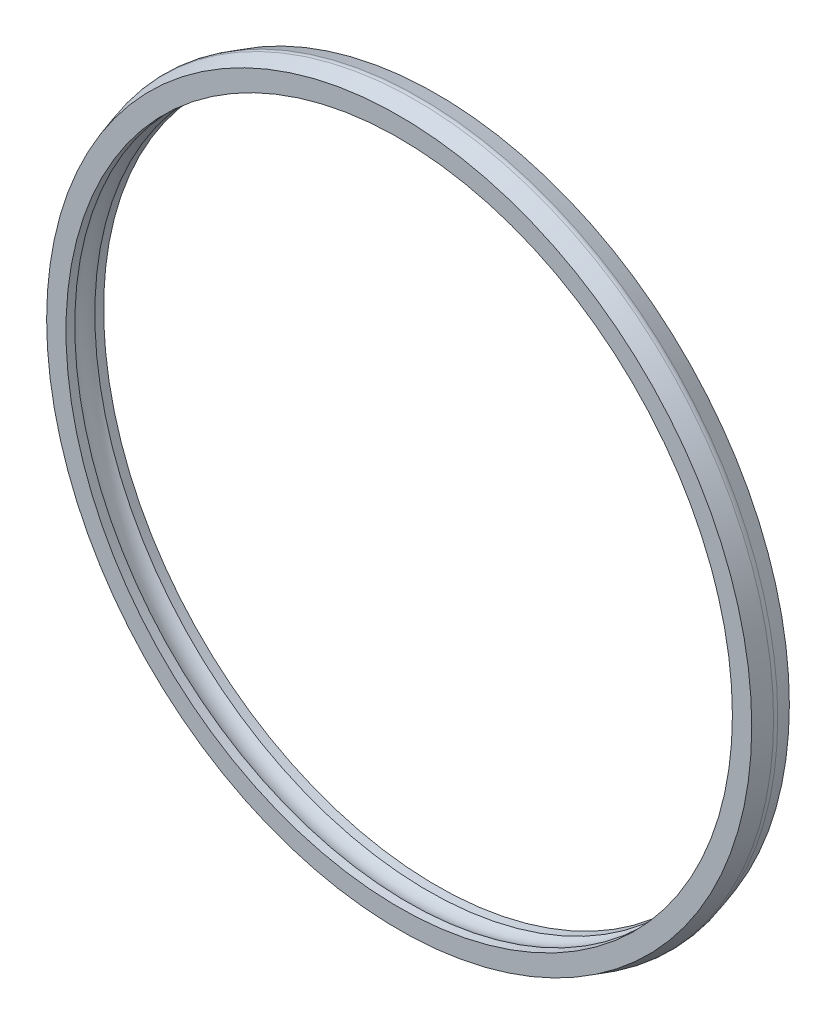
ISO-10303-21;
HEADER;
FILE_DESCRIPTION(('STEP AP214'),'2;1');
FILE_NAME('part.step','',(''),(''),'','','');
FILE_SCHEMA(('AUTOMOTIVE_DESIGN { 1 0 10303 214 1 1 1 1 }'));
ENDSEC;
DATA;
#1=APPLICATION_CONTEXT('core data for automotive mechanical design processes');
#2=APPLICATION_PROTOCOL_DEFINITION('international standard','automotive_design',2000,#1);
#3=PRODUCT_CONTEXT('',#1,'mechanical');
#4=PRODUCT('Part','Part','',(#3));
#5=PRODUCT_RELATED_PRODUCT_CATEGORY('part','',(#4));
#6=PRODUCT_DEFINITION_FORMATION('','',#4);
#7=PRODUCT_DEFINITION_CONTEXT('part definition',#1,'design');
#8=PRODUCT_DEFINITION('design','',#6,#7);
#9=PRODUCT_DEFINITION_SHAPE('','',#8);
#10=(LENGTH_UNIT() NAMED_UNIT(*) SI_UNIT(.MILLI.,.METRE.));
#11=(NAMED_UNIT(*) PLANE_ANGLE_UNIT() SI_UNIT($,.RADIAN.));
#12=(NAMED_UNIT(*) SI_UNIT($,.STERADIAN.) SOLID_ANGLE_UNIT());
#13=UNCERTAINTY_MEASURE_WITH_UNIT(LENGTH_MEASURE(1.E-05),#10,'distance_accuracy_value','');
#14=(GEOMETRIC_REPRESENTATION_CONTEXT(3) GLOBAL_UNCERTAINTY_ASSIGNED_CONTEXT((#13)) GLOBAL_UNIT_ASSIGNED_CONTEXT((#10,
#11,#12)) REPRESENTATION_CONTEXT('',''));
#15=CARTESIAN_POINT('',(0.,0.,0.));
#16=DIRECTION('',(0.,0.,1.));
#17=DIRECTION('',(1.,0.,0.));
#18=AXIS2_PLACEMENT_3D('',#15,#16,#17);
#19=CARTESIAN_POINT('',(0.,49.2,-2.625));
#20=DIRECTION('',(0.,0.,1.));
#21=DIRECTION('',(1.,0.,0.));
#22=AXIS2_PLACEMENT_3D('',#19,#20,#21);
#23=PLANE('',#22);
#24=CARTESIAN_POINT('',(0.,0.,-2.625));
#25=DIRECTION('',(0.,0.,1.));
#26=DIRECTION('',(1.,0.,0.));
#27=AXIS2_PLACEMENT_3D('',#24,#25,#26);
#28=CIRCLE('',#27,49.2);
#29=CARTESIAN_POINT('',(49.2,0.,-2.625));
#30=VERTEX_POINT('',#29);
#31=EDGE_CURVE('E69',#30,#30,#28,.T.);
#32=ORIENTED_EDGE('',*,*,#31,.F.);
#33=EDGE_LOOP('',(#32));
#34=FACE_BOUND('',#33,.T.);
#35=CARTESIAN_POINT('',(0.,0.,-2.625));
#36=DIRECTION('',(0.,0.,1.));
#37=DIRECTION('',(1.,0.,0.));
#38=AXIS2_PLACEMENT_3D('',#35,#36,#37);
#39=CIRCLE('',#38,46.5);
#40=CARTESIAN_POINT('',(46.5,0.,-2.625));
#41=VERTEX_POINT('',#40);
#42=EDGE_CURVE('E10',#41,#41,#39,.T.);
#43=ORIENTED_EDGE('',*,*,#42,.T.);
#44=EDGE_LOOP('',(#43));
#45=FACE_BOUND('',#44,.T.);
#46=ADVANCED_FACE('F41',(#34,#45),#23,.F.);
#47=CARTESIAN_POINT('',(0.,0.,0.));
#48=DIRECTION('',(0.,0.,1.));
#49=DIRECTION('',(1.,0.,0.));
#50=AXIS2_PLACEMENT_3D('',#47,#48,#49);
#51=CYLINDRICAL_SURFACE('',#50,46.5);
#52=ORIENTED_EDGE('',*,*,#42,.F.);
#53=EDGE_LOOP('',(#52));
#54=FACE_BOUND('',#53,.T.);
#55=CARTESIAN_POINT('',(0.,0.,-1.4));
#56=DIRECTION('',(0.,0.,1.));
#57=DIRECTION('',(1.,0.,0.));
#58=AXIS2_PLACEMENT_3D('',#55,#56,#57);
#59=CIRCLE('',#58,46.5);
#60=CARTESIAN_POINT('',(46.5,0.,-1.4));
#61=VERTEX_POINT('',#60);
#62=EDGE_CURVE('E47',#61,#61,#59,.T.);
#63=ORIENTED_EDGE('',*,*,#62,.T.);
#64=EDGE_LOOP('',(#63));
#65=FACE_BOUND('',#64,.T.);
#66=ADVANCED_FACE('F76',(#54,#65),#51,.F.);
#67=CARTESIAN_POINT('',(0.,0.,0.));
#68=DIRECTION('',(0.,0.,1.));
#69=DIRECTION('',(1.,0.,0.));
#70=AXIS2_PLACEMENT_3D('',#67,#68,#69);
#71=TOROIDAL_SURFACE('',#70,43.8467001677157,3.);
#72=ORIENTED_EDGE('',*,*,#62,.F.);
#73=EDGE_LOOP('',(#72));
#74=FACE_BOUND('',#73,.T.);
#75=CARTESIAN_POINT('',(0.,0.,1.4));
#76=DIRECTION('',(0.,0.,1.));
#77=DIRECTION('',(1.,0.,0.));
#78=AXIS2_PLACEMENT_3D('',#75,#76,#77);
#79=CIRCLE('',#78,46.5);
#80=CARTESIAN_POINT('',(46.5,0.,1.4));
#81=VERTEX_POINT('',#80);
#82=EDGE_CURVE('E51',#81,#81,#79,.T.);
#83=ORIENTED_EDGE('',*,*,#82,.T.);
#84=EDGE_LOOP('',(#83));
#85=FACE_BOUND('',#84,.T.);
#86=ADVANCED_FACE('F80',(#74,#85),#71,.F.);
#87=CARTESIAN_POINT('',(0.,0.,0.));
#88=DIRECTION('',(0.,0.,1.));
#89=DIRECTION('',(1.,0.,0.));
#90=AXIS2_PLACEMENT_3D('',#87,#88,#89);
#91=CYLINDRICAL_SURFACE('',#90,46.5);
#92=ORIENTED_EDGE('',*,*,#82,.F.);
#93=EDGE_LOOP('',(#92));
#94=FACE_BOUND('',#93,.T.);
#95=CARTESIAN_POINT('',(0.,0.,2.625));
#96=DIRECTION('',(0.,0.,1.));
#97=DIRECTION('',(1.,0.,0.));
#98=AXIS2_PLACEMENT_3D('',#95,#96,#97);
#99=CIRCLE('',#98,46.5);
#100=CARTESIAN_POINT('',(46.5,0.,2.625));
#101=VERTEX_POINT('',#100);
#102=EDGE_CURVE('E55',#101,#101,#99,.T.);
#103=ORIENTED_EDGE('',*,*,#102,.T.);
#104=EDGE_LOOP('',(#103));
#105=FACE_BOUND('',#104,.T.);
#106=ADVANCED_FACE('F85',(#94,#105),#91,.F.);
#107=CARTESIAN_POINT('',(0.,49.2,2.625));
#108=DIRECTION('',(0.,0.,-1.));
#109=DIRECTION('',(-1.,0.,0.));
#110=AXIS2_PLACEMENT_3D('',#107,#108,#109);
#111=PLANE('',#110);
#112=ORIENTED_EDGE('',*,*,#102,.F.);
#113=EDGE_LOOP('',(#112));
#114=FACE_BOUND('',#113,.T.);
#115=CARTESIAN_POINT('',(0.,0.,2.625));
#116=DIRECTION('',(0.,0.,1.));
#117=DIRECTION('',(1.,0.,0.));
#118=AXIS2_PLACEMENT_3D('',#115,#116,#117);
#119=CIRCLE('',#118,49.2);
#120=CARTESIAN_POINT('',(49.2,0.,2.625));
#121=VERTEX_POINT('',#120);
#122=EDGE_CURVE('E60',#121,#121,#119,.T.);
#123=ORIENTED_EDGE('',*,*,#122,.T.);
#124=EDGE_LOOP('',(#123));
#125=FACE_BOUND('',#124,.T.);
#126=ADVANCED_FACE('F91',(#114,#125),#111,.F.);
#127=CARTESIAN_POINT('',(0.,0.,0.291524108638551));
#128=DIRECTION('',(0.,0.,-1.));
#129=DIRECTION('',(-1.,0.,0.));
#130=AXIS2_PLACEMENT_3D('',#127,#128,#129);
#131=CONICAL_SURFACE('',#130,49.9111545573673,0.295819768538999);
#132=ORIENTED_EDGE('',*,*,#122,.F.);
#133=EDGE_LOOP('',(#132));
#134=FACE_BOUND('',#133,.T.);
#135=CARTESIAN_POINT('',(0.,0.,0.291524108638551));
#136=DIRECTION('',(0.,0.,1.));
#137=DIRECTION('',(1.,0.,0.));
#138=AXIS2_PLACEMENT_3D('',#135,#136,#137);
#139=CIRCLE('',#138,49.9111545573673);
#140=CARTESIAN_POINT('',(49.9111545573673,0.,0.291524108638551));
#141=VERTEX_POINT('',#140);
#142=EDGE_CURVE('E63',#141,#141,#139,.T.);
#143=ORIENTED_EDGE('',*,*,#142,.T.);
#144=EDGE_LOOP('',(#143));
#145=FACE_BOUND('',#144,.T.);
#146=ADVANCED_FACE('F95',(#134,#145),#131,.T.);
#147=CARTESIAN_POINT('',(0.,0.,0.));
#148=DIRECTION('',(0.,0.,1.));
#149=DIRECTION('',(1.,0.,0.));
#150=AXIS2_PLACEMENT_3D('',#147,#148,#149);
#151=TOROIDAL_SURFACE('',#150,48.9545910758971,0.99999999999999);
#152=ORIENTED_EDGE('',*,*,#142,.F.);
#153=EDGE_LOOP('',(#152));
#154=FACE_BOUND('',#153,.T.);
#155=CARTESIAN_POINT('',(0.,0.,-0.291524108638551));
#156=DIRECTION('',(0.,0.,1.));
#157=DIRECTION('',(1.,0.,0.));
#158=AXIS2_PLACEMENT_3D('',#155,#156,#157);
#159=CIRCLE('',#158,49.9111545573673);
#160=CARTESIAN_POINT('',(49.9111545573673,0.,-0.291524108638551));
#161=VERTEX_POINT('',#160);
#162=EDGE_CURVE('E66',#161,#161,#159,.T.);
#163=ORIENTED_EDGE('',*,*,#162,.T.);
#164=EDGE_LOOP('',(#163));
#165=FACE_BOUND('',#164,.T.);
#166=ADVANCED_FACE('F99',(#154,#165),#151,.T.);
#167=CARTESIAN_POINT('',(0.,0.,-2.625));
#168=DIRECTION('',(0.,0.,1.));
#169=DIRECTION('',(1.,0.,0.));
#170=AXIS2_PLACEMENT_3D('',#167,#168,#169);
#171=CONICAL_SURFACE('',#170,49.2,0.295819768538999);
#172=ORIENTED_EDGE('',*,*,#162,.F.);
#173=EDGE_LOOP('',(#172));
#174=FACE_BOUND('',#173,.T.);
#175=ORIENTED_EDGE('',*,*,#31,.T.);
#176=EDGE_LOOP('',(#175));
#177=FACE_BOUND('',#176,.T.);
#178=ADVANCED_FACE('F73',(#174,#177),#171,.T.);
#179=CLOSED_SHELL('',(#46,#66,#86,#106,#126,#146,#166,#178));
#180=MANIFOLD_SOLID_BREP('B2',#179);
#181=ADVANCED_BREP_SHAPE_REPRESENTATION('',(#18,#180),#14);
#182=SHAPE_DEFINITION_REPRESENTATION(#9,#181);
ENDSEC;
END-ISO-10303-21;
